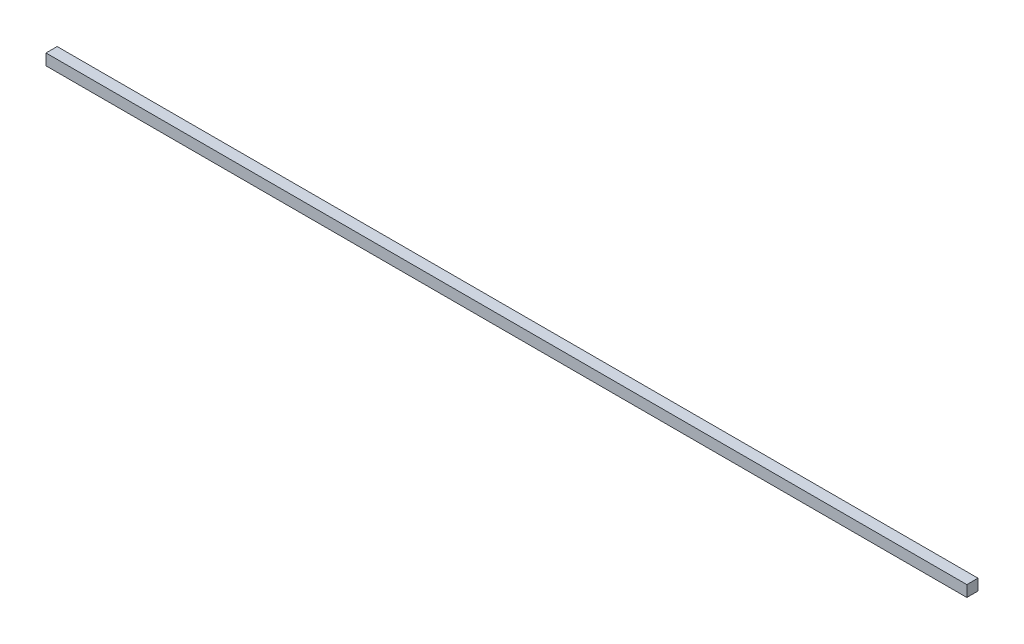
ISO-10303-21;
HEADER;
FILE_DESCRIPTION(('STEP AP214'),'2;1');
FILE_NAME('part.step','',(''),(''),'','','');
FILE_SCHEMA(('AUTOMOTIVE_DESIGN { 1 0 10303 214 1 1 1 1 }'));
ENDSEC;
DATA;
#1=APPLICATION_CONTEXT('core data for automotive mechanical design processes');
#2=APPLICATION_PROTOCOL_DEFINITION('international standard','automotive_design',2000,#1);
#3=PRODUCT_CONTEXT('',#1,'mechanical');
#4=PRODUCT('Part','Part','',(#3));
#5=PRODUCT_RELATED_PRODUCT_CATEGORY('part','',(#4));
#6=PRODUCT_DEFINITION_FORMATION('','',#4);
#7=PRODUCT_DEFINITION_CONTEXT('part definition',#1,'design');
#8=PRODUCT_DEFINITION('design','',#6,#7);
#9=PRODUCT_DEFINITION_SHAPE('','',#8);
#10=(LENGTH_UNIT() NAMED_UNIT(*) SI_UNIT(.MILLI.,.METRE.));
#11=(NAMED_UNIT(*) PLANE_ANGLE_UNIT() SI_UNIT($,.RADIAN.));
#12=(NAMED_UNIT(*) SI_UNIT($,.STERADIAN.) SOLID_ANGLE_UNIT());
#13=UNCERTAINTY_MEASURE_WITH_UNIT(LENGTH_MEASURE(1.E-05),#10,'distance_accuracy_value','');
#14=(GEOMETRIC_REPRESENTATION_CONTEXT(3) GLOBAL_UNCERTAINTY_ASSIGNED_CONTEXT((#13)) GLOBAL_UNIT_ASSIGNED_CONTEXT((#10,
#11,#12)) REPRESENTATION_CONTEXT('',''));
#15=CARTESIAN_POINT('',(0.,0.,0.));
#16=DIRECTION('',(0.,0.,1.));
#17=DIRECTION('',(1.,0.,0.));
#18=AXIS2_PLACEMENT_3D('',#15,#16,#17);
#19=CARTESIAN_POINT('',(1.5875,0.,0.));
#20=DIRECTION('',(1.,0.,0.));
#21=DIRECTION('',(0.,0.,-1.));
#22=AXIS2_PLACEMENT_3D('',#19,#20,#21);
#23=PLANE('',#22);
#24=DIRECTION('',(0.,0.,1.));
#25=VECTOR('',#24,1.);
#26=CARTESIAN_POINT('',(1.5875,21.7242917013493,0.));
#27=LINE('',#26,#25);
#28=CARTESIAN_POINT('',(1.5875,21.7242917013493,-612.921053398607));
#29=VERTEX_POINT('',#28);
#30=CARTESIAN_POINT('',(1.5875,21.7242917013493,-609.746053398607));
#31=VERTEX_POINT('',#30);
#32=EDGE_CURVE('E84',#29,#31,#27,.T.);
#33=ORIENTED_EDGE('',*,*,#32,.F.);
#34=DIRECTION('',(0.,-1.,0.));
#35=VECTOR('',#34,1.);
#36=CARTESIAN_POINT('',(1.5875,0.,-612.921053398607));
#37=LINE('',#36,#35);
#38=CARTESIAN_POINT('',(1.5875,18.5492917013493,-612.921053398607));
#39=VERTEX_POINT('',#38);
#40=EDGE_CURVE('E95',#29,#39,#37,.T.);
#41=ORIENTED_EDGE('',*,*,#40,.T.);
#42=DIRECTION('',(0.,0.,1.));
#43=VECTOR('',#42,1.);
#44=CARTESIAN_POINT('',(1.5875,18.5492917013493,0.));
#45=LINE('',#44,#43);
#46=CARTESIAN_POINT('',(1.5875,18.5492917013493,-609.746053398607));
#47=VERTEX_POINT('',#46);
#48=EDGE_CURVE('E87',#39,#47,#45,.T.);
#49=ORIENTED_EDGE('',*,*,#48,.T.);
#50=DIRECTION('',(0.,-1.,0.));
#51=VECTOR('',#50,1.);
#52=CARTESIAN_POINT('',(1.5875,0.,-609.746053398607));
#53=LINE('',#52,#51);
#54=EDGE_CURVE('E76',#31,#47,#53,.T.);
#55=ORIENTED_EDGE('',*,*,#54,.F.);
#56=EDGE_LOOP('',(#33,#41,#49,#55));
#57=FACE_BOUND('',#56,.T.);
#58=ADVANCED_FACE('F35',(#57),#23,.F.);
#59=CARTESIAN_POINT('',(268.015128060535,0.,-612.921053398607));
#60=DIRECTION('',(0.,0.,-1.));
#61=DIRECTION('',(-1.,0.,0.));
#62=AXIS2_PLACEMENT_3D('',#59,#60,#61);
#63=PLANE('',#62);
#64=DIRECTION('',(-1.,0.,0.));
#65=VECTOR('',#64,1.);
#66=CARTESIAN_POINT('',(268.015128060535,21.7242917013493,-612.921053398607));
#67=LINE('',#66,#65);
#68=CARTESIAN_POINT('',(263.525,21.7242917013493,-612.921053398607));
#69=VERTEX_POINT('',#68);
#70=EDGE_CURVE('E90',#69,#29,#67,.T.);
#71=ORIENTED_EDGE('',*,*,#70,.F.);
#72=DIRECTION('',(0.,-1.,0.));
#73=VECTOR('',#72,1.);
#74=CARTESIAN_POINT('',(263.525,0.,-612.921053398607));
#75=LINE('',#74,#73);
#76=CARTESIAN_POINT('',(263.525,18.5492917013493,-612.921053398607));
#77=VERTEX_POINT('',#76);
#78=EDGE_CURVE('E39',#69,#77,#75,.T.);
#79=ORIENTED_EDGE('',*,*,#78,.T.);
#80=DIRECTION('',(-1.,0.,0.));
#81=VECTOR('',#80,1.);
#82=CARTESIAN_POINT('',(268.015128060535,18.5492917013493,-612.921053398607));
#83=LINE('',#82,#81);
#84=EDGE_CURVE('E98',#77,#39,#83,.T.);
#85=ORIENTED_EDGE('',*,*,#84,.T.);
#86=ORIENTED_EDGE('',*,*,#40,.F.);
#87=EDGE_LOOP('',(#71,#79,#85,#86));
#88=FACE_BOUND('',#87,.T.);
#89=ADVANCED_FACE('F108',(#88),#63,.T.);
#90=CARTESIAN_POINT('',(268.015128060535,18.5492917013493,0.));
#91=DIRECTION('',(0.,-1.,0.));
#92=DIRECTION('',(0.,0.,-1.));
#93=AXIS2_PLACEMENT_3D('',#90,#91,#92);
#94=PLANE('',#93);
#95=ORIENTED_EDGE('',*,*,#84,.F.);
#96=DIRECTION('',(0.,0.,1.));
#97=VECTOR('',#96,1.);
#98=CARTESIAN_POINT('',(263.525,18.5492917013493,0.));
#99=LINE('',#98,#97);
#100=CARTESIAN_POINT('',(263.525,18.5492917013493,-609.746053398607));
#101=VERTEX_POINT('',#100);
#102=EDGE_CURVE('E104',#77,#101,#99,.T.);
#103=ORIENTED_EDGE('',*,*,#102,.T.);
#104=DIRECTION('',(-1.,0.,0.));
#105=VECTOR('',#104,1.);
#106=CARTESIAN_POINT('',(268.015128060535,18.5492917013493,-609.746053398607));
#107=LINE('',#106,#105);
#108=EDGE_CURVE('E80',#101,#47,#107,.T.);
#109=ORIENTED_EDGE('',*,*,#108,.T.);
#110=ORIENTED_EDGE('',*,*,#48,.F.);
#111=EDGE_LOOP('',(#95,#103,#109,#110));
#112=FACE_BOUND('',#111,.T.);
#113=ADVANCED_FACE('F103',(#112),#94,.T.);
#114=CARTESIAN_POINT('',(268.015128060535,0.,-609.746053398607));
#115=DIRECTION('',(0.,0.,-1.));
#116=DIRECTION('',(-1.,0.,0.));
#117=AXIS2_PLACEMENT_3D('',#114,#115,#116);
#118=PLANE('',#117);
#119=DIRECTION('',(0.,-1.,0.));
#120=VECTOR('',#119,1.);
#121=CARTESIAN_POINT('',(263.525,0.,-609.746053398607));
#122=LINE('',#121,#120);
#123=CARTESIAN_POINT('',(263.525,21.7242917013493,-609.746053398607));
#124=VERTEX_POINT('',#123);
#125=EDGE_CURVE('E44',#124,#101,#122,.T.);
#126=ORIENTED_EDGE('',*,*,#125,.F.);
#127=DIRECTION('',(-1.,0.,0.));
#128=VECTOR('',#127,1.);
#129=CARTESIAN_POINT('',(268.015128060535,21.7242917013493,-609.746053398607));
#130=LINE('',#129,#128);
#131=EDGE_CURVE('E73',#124,#31,#130,.T.);
#132=ORIENTED_EDGE('',*,*,#131,.T.);
#133=ORIENTED_EDGE('',*,*,#54,.T.);
#134=ORIENTED_EDGE('',*,*,#108,.F.);
#135=EDGE_LOOP('',(#126,#132,#133,#134));
#136=FACE_BOUND('',#135,.T.);
#137=ADVANCED_FACE('F75',(#136),#118,.F.);
#138=CARTESIAN_POINT('',(268.015128060535,21.7242917013493,0.));
#139=DIRECTION('',(0.,-1.,0.));
#140=DIRECTION('',(0.,0.,-1.));
#141=AXIS2_PLACEMENT_3D('',#138,#139,#140);
#142=PLANE('',#141);
#143=DIRECTION('',(0.,0.,1.));
#144=VECTOR('',#143,1.);
#145=CARTESIAN_POINT('',(263.525,21.7242917013493,0.));
#146=LINE('',#145,#144);
#147=EDGE_CURVE('E11',#69,#124,#146,.T.);
#148=ORIENTED_EDGE('',*,*,#147,.F.);
#149=ORIENTED_EDGE('',*,*,#70,.T.);
#150=ORIENTED_EDGE('',*,*,#32,.T.);
#151=ORIENTED_EDGE('',*,*,#131,.F.);
#152=EDGE_LOOP('',(#148,#149,#150,#151));
#153=FACE_BOUND('',#152,.T.);
#154=ADVANCED_FACE('F37',(#153),#142,.F.);
#155=CARTESIAN_POINT('',(263.525,0.,0.));
#156=DIRECTION('',(1.,0.,0.));
#157=DIRECTION('',(0.,0.,-1.));
#158=AXIS2_PLACEMENT_3D('',#155,#156,#157);
#159=PLANE('',#158);
#160=ORIENTED_EDGE('',*,*,#147,.T.);
#161=ORIENTED_EDGE('',*,*,#125,.T.);
#162=ORIENTED_EDGE('',*,*,#102,.F.);
#163=ORIENTED_EDGE('',*,*,#78,.F.);
#164=EDGE_LOOP('',(#160,#161,#162,#163));
#165=FACE_BOUND('',#164,.T.);
#166=ADVANCED_FACE('F109',(#165),#159,.T.);
#167=CLOSED_SHELL('',(#58,#89,#113,#137,#154,#166));
#168=MANIFOLD_SOLID_BREP('B2',#167);
#169=ADVANCED_BREP_SHAPE_REPRESENTATION('',(#18,#168),#14);
#170=SHAPE_DEFINITION_REPRESENTATION(#9,#169);
ENDSEC;
END-ISO-10303-21;
